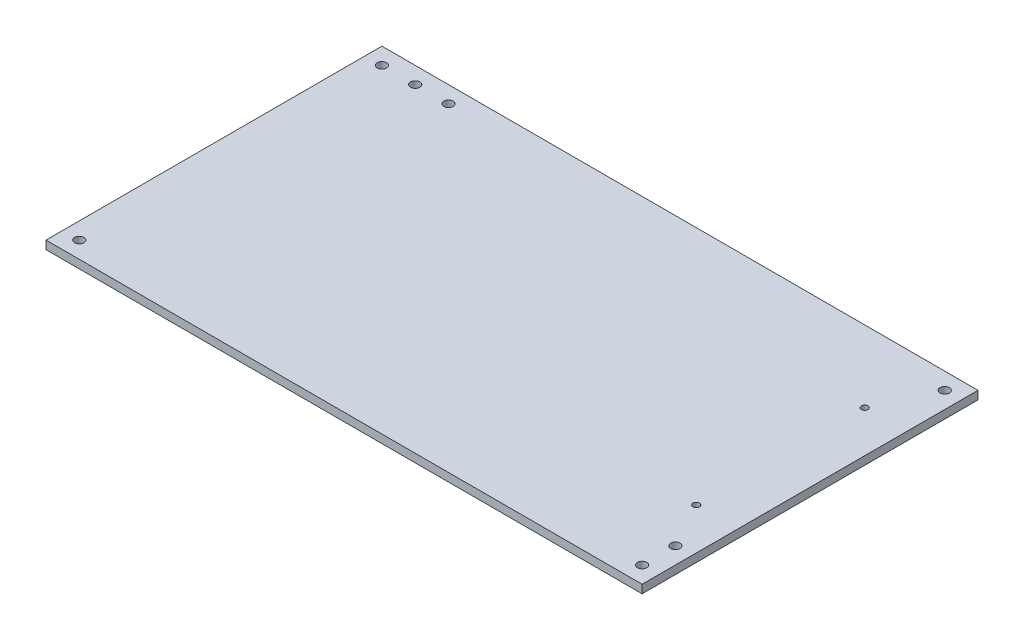
ISO-10303-21;
HEADER;
FILE_DESCRIPTION(('STEP AP214'),'2;1');
FILE_NAME('part.step','',(''),(''),'','','');
FILE_SCHEMA(('AUTOMOTIVE_DESIGN { 1 0 10303 214 1 1 1 1 }'));
ENDSEC;
DATA;
#1=APPLICATION_CONTEXT('core data for automotive mechanical design processes');
#2=APPLICATION_PROTOCOL_DEFINITION('international standard','automotive_design',2000,#1);
#3=PRODUCT_CONTEXT('',#1,'mechanical');
#4=PRODUCT('Part','Part','',(#3));
#5=PRODUCT_RELATED_PRODUCT_CATEGORY('part','',(#4));
#6=PRODUCT_DEFINITION_FORMATION('','',#4);
#7=PRODUCT_DEFINITION_CONTEXT('part definition',#1,'design');
#8=PRODUCT_DEFINITION('design','',#6,#7);
#9=PRODUCT_DEFINITION_SHAPE('','',#8);
#10=(LENGTH_UNIT() NAMED_UNIT(*) SI_UNIT(.MILLI.,.METRE.));
#11=(NAMED_UNIT(*) PLANE_ANGLE_UNIT() SI_UNIT($,.RADIAN.));
#12=(NAMED_UNIT(*) SI_UNIT($,.STERADIAN.) SOLID_ANGLE_UNIT());
#13=UNCERTAINTY_MEASURE_WITH_UNIT(LENGTH_MEASURE(1.E-05),#10,'distance_accuracy_value','');
#14=(GEOMETRIC_REPRESENTATION_CONTEXT(3) GLOBAL_UNCERTAINTY_ASSIGNED_CONTEXT((#13)) GLOBAL_UNIT_ASSIGNED_CONTEXT((#10,
#11,#12)) REPRESENTATION_CONTEXT('',''));
#15=CARTESIAN_POINT('',(0.,0.,0.));
#16=DIRECTION('',(0.,0.,1.));
#17=DIRECTION('',(1.,0.,0.));
#18=AXIS2_PLACEMENT_3D('',#15,#16,#17);
#19=CARTESIAN_POINT('',(300.,25.4,0.));
#20=DIRECTION('',(-1.,0.,0.));
#21=DIRECTION('',(0.,0.,1.));
#22=AXIS2_PLACEMENT_3D('',#19,#20,#21);
#23=PLANE('',#22);
#24=DIRECTION('',(0.,0.,-1.));
#25=VECTOR('',#24,1.);
#26=CARTESIAN_POINT('',(300.,19.05,0.));
#27=LINE('',#26,#25);
#28=CARTESIAN_POINT('',(300.,19.05,-150.));
#29=VERTEX_POINT('',#28);
#30=CARTESIAN_POINT('',(300.,19.05,-406.45));
#31=VERTEX_POINT('',#30);
#32=EDGE_CURVE('E110',#29,#31,#27,.T.);
#33=ORIENTED_EDGE('',*,*,#32,.F.);
#34=DIRECTION('',(0.,-1.,0.));
#35=VECTOR('',#34,1.);
#36=CARTESIAN_POINT('',(300.,25.4,-150.));
#37=LINE('',#36,#35);
#38=CARTESIAN_POINT('',(300.,25.4,-150.));
#39=VERTEX_POINT('',#38);
#40=EDGE_CURVE('E11',#39,#29,#37,.T.);
#41=ORIENTED_EDGE('',*,*,#40,.F.);
#42=DIRECTION('',(0.,0.,-1.));
#43=VECTOR('',#42,1.);
#44=CARTESIAN_POINT('',(300.,25.4,0.));
#45=LINE('',#44,#43);
#46=CARTESIAN_POINT('',(300.,25.4,-406.45));
#47=VERTEX_POINT('',#46);
#48=EDGE_CURVE('E95',#39,#47,#45,.T.);
#49=ORIENTED_EDGE('',*,*,#48,.T.);
#50=DIRECTION('',(0.,-1.,0.));
#51=VECTOR('',#50,1.);
#52=CARTESIAN_POINT('',(300.,25.4,-406.45));
#53=LINE('',#52,#51);
#54=EDGE_CURVE('E58',#47,#31,#53,.T.);
#55=ORIENTED_EDGE('',*,*,#54,.T.);
#56=EDGE_LOOP('',(#33,#41,#49,#55));
#57=FACE_BOUND('',#56,.T.);
#58=ADVANCED_FACE('F42',(#57),#23,.T.);
#59=CARTESIAN_POINT('',(0.,25.4,-150.));
#60=DIRECTION('',(0.,0.,-1.));
#61=DIRECTION('',(-1.,0.,0.));
#62=AXIS2_PLACEMENT_3D('',#59,#60,#61);
#63=PLANE('',#62);
#64=DIRECTION('',(1.,0.,0.));
#65=VECTOR('',#64,1.);
#66=CARTESIAN_POINT('',(0.,19.05,-150.));
#67=LINE('',#66,#65);
#68=CARTESIAN_POINT('',(755.092,19.05,-150.));
#69=VERTEX_POINT('',#68);
#70=EDGE_CURVE('E96',#29,#69,#67,.T.);
#71=ORIENTED_EDGE('',*,*,#70,.T.);
#72=DIRECTION('',(0.,-1.,0.));
#73=VECTOR('',#72,1.);
#74=CARTESIAN_POINT('',(755.092,25.4,-150.));
#75=LINE('',#74,#73);
#76=CARTESIAN_POINT('',(755.092,25.4,-150.));
#77=VERTEX_POINT('',#76);
#78=EDGE_CURVE('E55',#77,#69,#75,.T.);
#79=ORIENTED_EDGE('',*,*,#78,.F.);
#80=DIRECTION('',(1.,0.,0.));
#81=VECTOR('',#80,1.);
#82=CARTESIAN_POINT('',(0.,25.4,-150.));
#83=LINE('',#82,#81);
#84=EDGE_CURVE('E86',#39,#77,#83,.T.);
#85=ORIENTED_EDGE('',*,*,#84,.F.);
#86=ORIENTED_EDGE('',*,*,#40,.T.);
#87=EDGE_LOOP('',(#71,#79,#85,#86));
#88=FACE_BOUND('',#87,.T.);
#89=ADVANCED_FACE('F98',(#88),#63,.F.);
#90=CARTESIAN_POINT('',(755.092,25.4,-1.50655139565147E-13));
#91=DIRECTION('',(1.,0.,0.));
#92=DIRECTION('',(0.,0.,-1.));
#93=AXIS2_PLACEMENT_3D('',#90,#91,#92);
#94=PLANE('',#93);
#95=DIRECTION('',(0.,0.,1.));
#96=VECTOR('',#95,1.);
#97=CARTESIAN_POINT('',(755.092,19.05,-1.50655139565147E-13));
#98=LINE('',#97,#96);
#99=CARTESIAN_POINT('',(755.092,19.05,-406.45));
#100=VERTEX_POINT('',#99);
#101=EDGE_CURVE('E111',#100,#69,#98,.T.);
#102=ORIENTED_EDGE('',*,*,#101,.F.);
#103=DIRECTION('',(0.,-1.,0.));
#104=VECTOR('',#103,1.);
#105=CARTESIAN_POINT('',(755.092,25.4,-406.45));
#106=LINE('',#105,#104);
#107=CARTESIAN_POINT('',(755.092,25.4,-406.45));
#108=VERTEX_POINT('',#107);
#109=EDGE_CURVE('E71',#108,#100,#106,.T.);
#110=ORIENTED_EDGE('',*,*,#109,.F.);
#111=DIRECTION('',(0.,0.,1.));
#112=VECTOR('',#111,1.);
#113=CARTESIAN_POINT('',(755.092,25.4,-1.50655139565147E-13));
#114=LINE('',#113,#112);
#115=EDGE_CURVE('E93',#108,#77,#114,.T.);
#116=ORIENTED_EDGE('',*,*,#115,.T.);
#117=ORIENTED_EDGE('',*,*,#78,.T.);
#118=EDGE_LOOP('',(#102,#110,#116,#117));
#119=FACE_BOUND('',#118,.T.);
#120=ADVANCED_FACE('F103',(#119),#94,.T.);
#121=CARTESIAN_POINT('',(0.,25.4,-406.45));
#122=DIRECTION('',(0.,0.,-1.));
#123=DIRECTION('',(-1.,0.,0.));
#124=AXIS2_PLACEMENT_3D('',#121,#122,#123);
#125=PLANE('',#124);
#126=DIRECTION('',(1.,0.,0.));
#127=VECTOR('',#126,1.);
#128=CARTESIAN_POINT('',(0.,19.05,-406.45));
#129=LINE('',#128,#127);
#130=EDGE_CURVE('E113',#31,#100,#129,.T.);
#131=ORIENTED_EDGE('',*,*,#130,.F.);
#132=ORIENTED_EDGE('',*,*,#54,.F.);
#133=DIRECTION('',(1.,0.,0.));
#134=VECTOR('',#133,1.);
#135=CARTESIAN_POINT('',(0.,25.4,-406.45));
#136=LINE('',#135,#134);
#137=EDGE_CURVE('E105',#47,#108,#136,.T.);
#138=ORIENTED_EDGE('',*,*,#137,.T.);
#139=ORIENTED_EDGE('',*,*,#109,.T.);
#140=EDGE_LOOP('',(#131,#132,#138,#139));
#141=FACE_BOUND('',#140,.T.);
#142=ADVANCED_FACE('F178',(#141),#125,.T.);
#143=CARTESIAN_POINT('',(0.,25.4,0.));
#144=DIRECTION('',(0.,1.,0.));
#145=DIRECTION('',(0.,0.,1.));
#146=AXIS2_PLACEMENT_3D('',#143,#144,#145);
#147=PLANE('',#146);
#148=CARTESIAN_POINT('',(723.342,25.4,-351.68125));
#149=DIRECTION('',(0.,1.,0.));
#150=DIRECTION('',(0.,0.,1.));
#151=AXIS2_PLACEMENT_3D('',#148,#149,#150);
#152=CIRCLE('',#151,2.48919999999997);
#153=CARTESIAN_POINT('',(723.342,25.4,-349.19205));
#154=VERTEX_POINT('',#153);
#155=EDGE_CURVE('E169',#154,#154,#152,.T.);
#156=ORIENTED_EDGE('',*,*,#155,.F.);
#157=EDGE_LOOP('',(#156));
#158=FACE_BOUND('',#157,.T.);
#159=CARTESIAN_POINT('',(723.342,25.4,-223.09375));
#160=DIRECTION('',(0.,1.,0.));
#161=DIRECTION('',(0.,0.,1.));
#162=AXIS2_PLACEMENT_3D('',#159,#160,#161);
#163=CIRCLE('',#162,2.48919999999997);
#164=CARTESIAN_POINT('',(723.342,25.4,-220.60455));
#165=VERTEX_POINT('',#164);
#166=EDGE_CURVE('E161',#165,#165,#163,.T.);
#167=ORIENTED_EDGE('',*,*,#166,.F.);
#168=EDGE_LOOP('',(#167));
#169=FACE_BOUND('',#168,.T.);
#170=CARTESIAN_POINT('',(312.7,25.4,-393.75));
#171=DIRECTION('',(0.,1.,0.));
#172=DIRECTION('',(0.,0.,1.));
#173=AXIS2_PLACEMENT_3D('',#170,#171,#172);
#174=CIRCLE('',#173,3.56869999999998);
#175=CARTESIAN_POINT('',(312.7,25.4,-390.1813));
#176=VERTEX_POINT('',#175);
#177=EDGE_CURVE('E160',#176,#176,#174,.T.);
#178=ORIENTED_EDGE('',*,*,#177,.F.);
#179=EDGE_LOOP('',(#178));
#180=FACE_BOUND('',#179,.T.);
#181=CARTESIAN_POINT('',(338.1,25.4,-393.75));
#182=DIRECTION('',(0.,1.,0.));
#183=DIRECTION('',(0.,0.,1.));
#184=AXIS2_PLACEMENT_3D('',#181,#182,#183);
#185=CIRCLE('',#184,3.56869999999998);
#186=CARTESIAN_POINT('',(338.1,25.4,-390.1813));
#187=VERTEX_POINT('',#186);
#188=EDGE_CURVE('E151',#187,#187,#185,.T.);
#189=ORIENTED_EDGE('',*,*,#188,.F.);
#190=EDGE_LOOP('',(#189));
#191=FACE_BOUND('',#190,.T.);
#192=CARTESIAN_POINT('',(363.5,25.4,-393.75));
#193=DIRECTION('',(0.,1.,0.));
#194=DIRECTION('',(0.,0.,1.));
#195=AXIS2_PLACEMENT_3D('',#192,#193,#194);
#196=CIRCLE('',#195,3.56869999999998);
#197=CARTESIAN_POINT('',(363.5,25.4,-390.1813));
#198=VERTEX_POINT('',#197);
#199=EDGE_CURVE('E143',#198,#198,#196,.T.);
#200=ORIENTED_EDGE('',*,*,#199,.F.);
#201=EDGE_LOOP('',(#200));
#202=FACE_BOUND('',#201,.T.);
#203=CARTESIAN_POINT('',(312.7,25.4,-162.7));
#204=DIRECTION('',(0.,1.,0.));
#205=DIRECTION('',(0.,0.,1.));
#206=AXIS2_PLACEMENT_3D('',#203,#204,#205);
#207=CIRCLE('',#206,3.56869999999998);
#208=CARTESIAN_POINT('',(312.7,25.4,-159.1313));
#209=VERTEX_POINT('',#208);
#210=EDGE_CURVE('E139',#209,#209,#207,.T.);
#211=ORIENTED_EDGE('',*,*,#210,.F.);
#212=EDGE_LOOP('',(#211));
#213=FACE_BOUND('',#212,.T.);
#214=CARTESIAN_POINT('',(742.392,25.4,-162.7));
#215=DIRECTION('',(0.,1.,0.));
#216=DIRECTION('',(0.,0.,1.));
#217=AXIS2_PLACEMENT_3D('',#214,#215,#216);
#218=CIRCLE('',#217,3.56869999999998);
#219=CARTESIAN_POINT('',(742.392,25.4,-159.1313));
#220=VERTEX_POINT('',#219);
#221=EDGE_CURVE('E132',#220,#220,#218,.T.);
#222=ORIENTED_EDGE('',*,*,#221,.F.);
#223=EDGE_LOOP('',(#222));
#224=FACE_BOUND('',#223,.T.);
#225=CARTESIAN_POINT('',(742.392000000001,25.4,-188.1));
#226=DIRECTION('',(0.,1.,0.));
#227=DIRECTION('',(0.,0.,1.));
#228=AXIS2_PLACEMENT_3D('',#225,#226,#227);
#229=CIRCLE('',#228,3.56869999999998);
#230=CARTESIAN_POINT('',(742.392000000001,25.4,-184.5313));
#231=VERTEX_POINT('',#230);
#232=EDGE_CURVE('E126',#231,#231,#229,.T.);
#233=ORIENTED_EDGE('',*,*,#232,.F.);
#234=EDGE_LOOP('',(#233));
#235=FACE_BOUND('',#234,.T.);
#236=CARTESIAN_POINT('',(742.392,25.4,-393.75));
#237=DIRECTION('',(0.,1.,0.));
#238=DIRECTION('',(0.,0.,1.));
#239=AXIS2_PLACEMENT_3D('',#236,#237,#238);
#240=CIRCLE('',#239,3.56869999999998);
#241=CARTESIAN_POINT('',(742.392,25.4,-390.1813));
#242=VERTEX_POINT('',#241);
#243=EDGE_CURVE('E122',#242,#242,#240,.T.);
#244=ORIENTED_EDGE('',*,*,#243,.F.);
#245=EDGE_LOOP('',(#244));
#246=FACE_BOUND('',#245,.T.);
#247=ORIENTED_EDGE('',*,*,#48,.F.);
#248=ORIENTED_EDGE('',*,*,#84,.T.);
#249=ORIENTED_EDGE('',*,*,#115,.F.);
#250=ORIENTED_EDGE('',*,*,#137,.F.);
#251=EDGE_LOOP('',(#247,#248,#249,#250));
#252=FACE_BOUND('',#251,.T.);
#253=ADVANCED_FACE('F87',(#158,#169,#180,#191,#202,#213,#224,#235,#246,#252),#147,.T.);
#254=CARTESIAN_POINT('',(0.,19.05,0.));
#255=DIRECTION('',(0.,1.,0.));
#256=DIRECTION('',(0.,0.,1.));
#257=AXIS2_PLACEMENT_3D('',#254,#255,#256);
#258=PLANE('',#257);
#259=CARTESIAN_POINT('',(723.342,19.05,-351.68125));
#260=DIRECTION('',(0.,1.,0.));
#261=DIRECTION('',(0.,0.,1.));
#262=AXIS2_PLACEMENT_3D('',#259,#260,#261);
#263=CIRCLE('',#262,2.48919999999997);
#264=CARTESIAN_POINT('',(723.342,19.05,-349.19205));
#265=VERTEX_POINT('',#264);
#266=EDGE_CURVE('E168',#265,#265,#263,.T.);
#267=ORIENTED_EDGE('',*,*,#266,.T.);
#268=EDGE_LOOP('',(#267));
#269=FACE_BOUND('',#268,.T.);
#270=CARTESIAN_POINT('',(723.342,19.05,-223.09375));
#271=DIRECTION('',(0.,1.,0.));
#272=DIRECTION('',(0.,0.,1.));
#273=AXIS2_PLACEMENT_3D('',#270,#271,#272);
#274=CIRCLE('',#273,2.48919999999997);
#275=CARTESIAN_POINT('',(723.342,19.05,-220.60455));
#276=VERTEX_POINT('',#275);
#277=EDGE_CURVE('E157',#276,#276,#274,.T.);
#278=ORIENTED_EDGE('',*,*,#277,.T.);
#279=EDGE_LOOP('',(#278));
#280=FACE_BOUND('',#279,.T.);
#281=CARTESIAN_POINT('',(312.7,19.05,-393.75));
#282=DIRECTION('',(0.,1.,0.));
#283=DIRECTION('',(0.,0.,1.));
#284=AXIS2_PLACEMENT_3D('',#281,#282,#283);
#285=CIRCLE('',#284,3.56869999999998);
#286=CARTESIAN_POINT('',(312.7,19.05,-390.1813));
#287=VERTEX_POINT('',#286);
#288=EDGE_CURVE('E153',#287,#287,#285,.T.);
#289=ORIENTED_EDGE('',*,*,#288,.T.);
#290=EDGE_LOOP('',(#289));
#291=FACE_BOUND('',#290,.T.);
#292=CARTESIAN_POINT('',(338.1,19.05,-393.75));
#293=DIRECTION('',(0.,1.,0.));
#294=DIRECTION('',(0.,0.,1.));
#295=AXIS2_PLACEMENT_3D('',#292,#293,#294);
#296=CIRCLE('',#295,3.56869999999998);
#297=CARTESIAN_POINT('',(338.1,19.05,-390.1813));
#298=VERTEX_POINT('',#297);
#299=EDGE_CURVE('E150',#298,#298,#296,.T.);
#300=ORIENTED_EDGE('',*,*,#299,.T.);
#301=EDGE_LOOP('',(#300));
#302=FACE_BOUND('',#301,.T.);
#303=CARTESIAN_POINT('',(363.5,19.05,-393.75));
#304=DIRECTION('',(0.,1.,0.));
#305=DIRECTION('',(0.,0.,1.));
#306=AXIS2_PLACEMENT_3D('',#303,#304,#305);
#307=CIRCLE('',#306,3.56869999999998);
#308=CARTESIAN_POINT('',(363.5,19.05,-390.1813));
#309=VERTEX_POINT('',#308);
#310=EDGE_CURVE('E145',#309,#309,#307,.T.);
#311=ORIENTED_EDGE('',*,*,#310,.T.);
#312=EDGE_LOOP('',(#311));
#313=FACE_BOUND('',#312,.T.);
#314=CARTESIAN_POINT('',(312.7,19.05,-162.7));
#315=DIRECTION('',(0.,1.,0.));
#316=DIRECTION('',(0.,0.,1.));
#317=AXIS2_PLACEMENT_3D('',#314,#315,#316);
#318=CIRCLE('',#317,3.56869999999998);
#319=CARTESIAN_POINT('',(312.7,19.05,-159.1313));
#320=VERTEX_POINT('',#319);
#321=EDGE_CURVE('E138',#320,#320,#318,.T.);
#322=ORIENTED_EDGE('',*,*,#321,.T.);
#323=EDGE_LOOP('',(#322));
#324=FACE_BOUND('',#323,.T.);
#325=CARTESIAN_POINT('',(742.392,19.05,-162.7));
#326=DIRECTION('',(0.,1.,0.));
#327=DIRECTION('',(0.,0.,1.));
#328=AXIS2_PLACEMENT_3D('',#325,#326,#327);
#329=CIRCLE('',#328,3.56869999999998);
#330=CARTESIAN_POINT('',(742.392,19.05,-159.1313));
#331=VERTEX_POINT('',#330);
#332=EDGE_CURVE('E127',#331,#331,#329,.T.);
#333=ORIENTED_EDGE('',*,*,#332,.T.);
#334=EDGE_LOOP('',(#333));
#335=FACE_BOUND('',#334,.T.);
#336=CARTESIAN_POINT('',(742.392000000001,19.05,-188.1));
#337=DIRECTION('',(0.,1.,0.));
#338=DIRECTION('',(0.,0.,1.));
#339=AXIS2_PLACEMENT_3D('',#336,#337,#338);
#340=CIRCLE('',#339,3.56869999999998);
#341=CARTESIAN_POINT('',(742.392000000001,19.05,-184.5313));
#342=VERTEX_POINT('',#341);
#343=EDGE_CURVE('E121',#342,#342,#340,.T.);
#344=ORIENTED_EDGE('',*,*,#343,.T.);
#345=EDGE_LOOP('',(#344));
#346=FACE_BOUND('',#345,.T.);
#347=CARTESIAN_POINT('',(742.392,19.05,-393.75));
#348=DIRECTION('',(0.,1.,0.));
#349=DIRECTION('',(0.,0.,1.));
#350=AXIS2_PLACEMENT_3D('',#347,#348,#349);
#351=CIRCLE('',#350,3.56869999999998);
#352=CARTESIAN_POINT('',(742.392,19.05,-390.1813));
#353=VERTEX_POINT('',#352);
#354=EDGE_CURVE('E107',#353,#353,#351,.T.);
#355=ORIENTED_EDGE('',*,*,#354,.T.);
#356=EDGE_LOOP('',(#355));
#357=FACE_BOUND('',#356,.T.);
#358=ORIENTED_EDGE('',*,*,#32,.T.);
#359=ORIENTED_EDGE('',*,*,#130,.T.);
#360=ORIENTED_EDGE('',*,*,#101,.T.);
#361=ORIENTED_EDGE('',*,*,#70,.F.);
#362=EDGE_LOOP('',(#358,#359,#360,#361));
#363=FACE_BOUND('',#362,.T.);
#364=ADVANCED_FACE('F180',(#269,#280,#291,#302,#313,#324,#335,#346,#357,#363),#258,.F.);
#365=CARTESIAN_POINT('',(742.392,25.4,-393.75));
#366=DIRECTION('',(0.,1.,0.));
#367=DIRECTION('',(0.,0.,1.));
#368=AXIS2_PLACEMENT_3D('',#365,#366,#367);
#369=CYLINDRICAL_SURFACE('',#368,3.56869999999998);
#370=ORIENTED_EDGE('',*,*,#354,.F.);
#371=EDGE_LOOP('',(#370));
#372=FACE_BOUND('',#371,.T.);
#373=ORIENTED_EDGE('',*,*,#243,.T.);
#374=EDGE_LOOP('',(#373));
#375=FACE_BOUND('',#374,.T.);
#376=ADVANCED_FACE('F196',(#372,#375),#369,.F.);
#377=CARTESIAN_POINT('',(742.392000000001,25.4,-188.1));
#378=DIRECTION('',(0.,1.,0.));
#379=DIRECTION('',(0.,0.,1.));
#380=AXIS2_PLACEMENT_3D('',#377,#378,#379);
#381=CYLINDRICAL_SURFACE('',#380,3.56869999999998);
#382=ORIENTED_EDGE('',*,*,#343,.F.);
#383=EDGE_LOOP('',(#382));
#384=FACE_BOUND('',#383,.T.);
#385=ORIENTED_EDGE('',*,*,#232,.T.);
#386=EDGE_LOOP('',(#385));
#387=FACE_BOUND('',#386,.T.);
#388=ADVANCED_FACE('F197',(#384,#387),#381,.F.);
#389=CARTESIAN_POINT('',(742.392,25.4,-162.7));
#390=DIRECTION('',(0.,1.,0.));
#391=DIRECTION('',(0.,0.,1.));
#392=AXIS2_PLACEMENT_3D('',#389,#390,#391);
#393=CYLINDRICAL_SURFACE('',#392,3.56869999999998);
#394=ORIENTED_EDGE('',*,*,#332,.F.);
#395=EDGE_LOOP('',(#394));
#396=FACE_BOUND('',#395,.T.);
#397=ORIENTED_EDGE('',*,*,#221,.T.);
#398=EDGE_LOOP('',(#397));
#399=FACE_BOUND('',#398,.T.);
#400=ADVANCED_FACE('F202',(#396,#399),#393,.F.);
#401=CARTESIAN_POINT('',(312.7,25.4,-162.7));
#402=DIRECTION('',(0.,1.,0.));
#403=DIRECTION('',(0.,0.,1.));
#404=AXIS2_PLACEMENT_3D('',#401,#402,#403);
#405=CYLINDRICAL_SURFACE('',#404,3.56869999999998);
#406=ORIENTED_EDGE('',*,*,#321,.F.);
#407=EDGE_LOOP('',(#406));
#408=FACE_BOUND('',#407,.T.);
#409=ORIENTED_EDGE('',*,*,#210,.T.);
#410=EDGE_LOOP('',(#409));
#411=FACE_BOUND('',#410,.T.);
#412=ADVANCED_FACE('F264',(#408,#411),#405,.F.);
#413=CARTESIAN_POINT('',(363.5,25.4,-393.75));
#414=DIRECTION('',(0.,1.,0.));
#415=DIRECTION('',(0.,0.,1.));
#416=AXIS2_PLACEMENT_3D('',#413,#414,#415);
#417=CYLINDRICAL_SURFACE('',#416,3.56869999999998);
#418=ORIENTED_EDGE('',*,*,#310,.F.);
#419=EDGE_LOOP('',(#418));
#420=FACE_BOUND('',#419,.T.);
#421=ORIENTED_EDGE('',*,*,#199,.T.);
#422=EDGE_LOOP('',(#421));
#423=FACE_BOUND('',#422,.T.);
#424=ADVANCED_FACE('F274',(#420,#423),#417,.F.);
#425=CARTESIAN_POINT('',(338.1,25.4,-393.75));
#426=DIRECTION('',(0.,1.,0.));
#427=DIRECTION('',(0.,0.,1.));
#428=AXIS2_PLACEMENT_3D('',#425,#426,#427);
#429=CYLINDRICAL_SURFACE('',#428,3.56869999999998);
#430=ORIENTED_EDGE('',*,*,#299,.F.);
#431=EDGE_LOOP('',(#430));
#432=FACE_BOUND('',#431,.T.);
#433=ORIENTED_EDGE('',*,*,#188,.T.);
#434=EDGE_LOOP('',(#433));
#435=FACE_BOUND('',#434,.T.);
#436=ADVANCED_FACE('F282',(#432,#435),#429,.F.);
#437=CARTESIAN_POINT('',(312.7,25.4,-393.75));
#438=DIRECTION('',(0.,1.,0.));
#439=DIRECTION('',(0.,0.,1.));
#440=AXIS2_PLACEMENT_3D('',#437,#438,#439);
#441=CYLINDRICAL_SURFACE('',#440,3.56869999999998);
#442=ORIENTED_EDGE('',*,*,#288,.F.);
#443=EDGE_LOOP('',(#442));
#444=FACE_BOUND('',#443,.T.);
#445=ORIENTED_EDGE('',*,*,#177,.T.);
#446=EDGE_LOOP('',(#445));
#447=FACE_BOUND('',#446,.T.);
#448=ADVANCED_FACE('F292',(#444,#447),#441,.F.);
#449=CARTESIAN_POINT('',(723.342,25.4,-223.09375));
#450=DIRECTION('',(0.,1.,0.));
#451=DIRECTION('',(0.,0.,1.));
#452=AXIS2_PLACEMENT_3D('',#449,#450,#451);
#453=CYLINDRICAL_SURFACE('',#452,2.48919999999997);
#454=ORIENTED_EDGE('',*,*,#277,.F.);
#455=EDGE_LOOP('',(#454));
#456=FACE_BOUND('',#455,.T.);
#457=ORIENTED_EDGE('',*,*,#166,.T.);
#458=EDGE_LOOP('',(#457));
#459=FACE_BOUND('',#458,.T.);
#460=ADVANCED_FACE('F301',(#456,#459),#453,.F.);
#461=CARTESIAN_POINT('',(723.342,25.4,-351.68125));
#462=DIRECTION('',(0.,1.,0.));
#463=DIRECTION('',(0.,0.,1.));
#464=AXIS2_PLACEMENT_3D('',#461,#462,#463);
#465=CYLINDRICAL_SURFACE('',#464,2.48919999999997);
#466=ORIENTED_EDGE('',*,*,#266,.F.);
#467=EDGE_LOOP('',(#466));
#468=FACE_BOUND('',#467,.T.);
#469=ORIENTED_EDGE('',*,*,#155,.T.);
#470=EDGE_LOOP('',(#469));
#471=FACE_BOUND('',#470,.T.);
#472=ADVANCED_FACE('F173',(#468,#471),#465,.F.);
#473=CLOSED_SHELL('',(#58,#89,#120,#142,#253,#364,#376,#388,#400,#412,#424,#436,#448,#460,#472));
#474=MANIFOLD_SOLID_BREP('B2',#473);
#475=ADVANCED_BREP_SHAPE_REPRESENTATION('',(#18,#474),#14);
#476=SHAPE_DEFINITION_REPRESENTATION(#9,#475);
ENDSEC;
END-ISO-10303-21;
